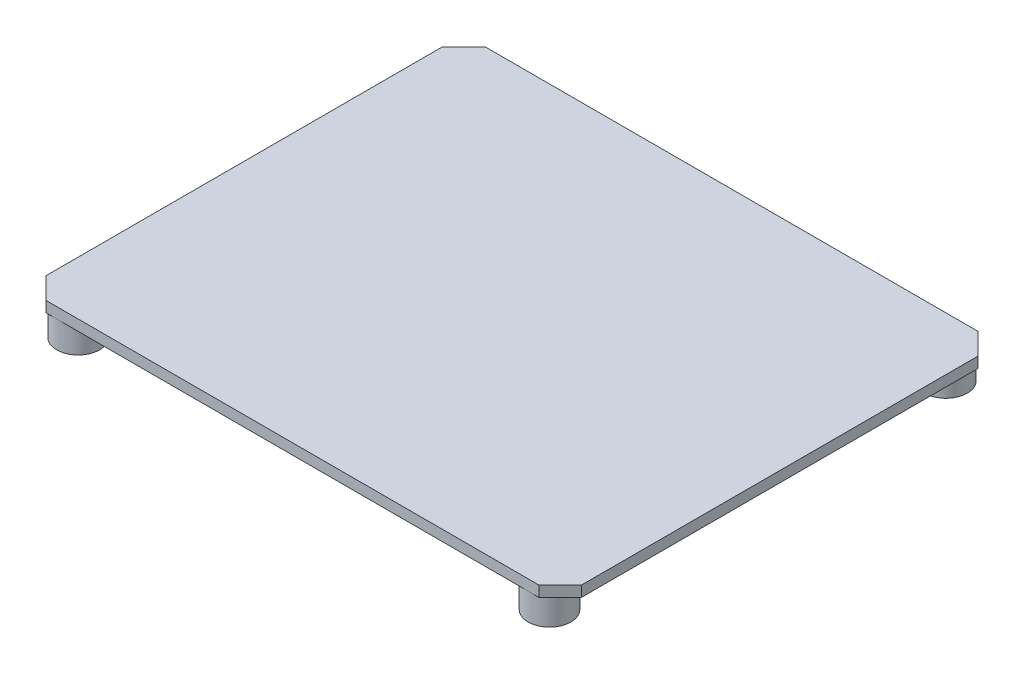
ISO-10303-21;
HEADER;
FILE_DESCRIPTION(('STEP AP214'),'2;1');
FILE_NAME('part.step','',(''),(''),'','','');
FILE_SCHEMA(('AUTOMOTIVE_DESIGN { 1 0 10303 214 1 1 1 1 }'));
ENDSEC;
DATA;
#1=APPLICATION_CONTEXT('core data for automotive mechanical design processes');
#2=APPLICATION_PROTOCOL_DEFINITION('international standard','automotive_design',2000,#1);
#3=PRODUCT_CONTEXT('',#1,'mechanical');
#4=PRODUCT('Part','Part','',(#3));
#5=PRODUCT_RELATED_PRODUCT_CATEGORY('part','',(#4));
#6=PRODUCT_DEFINITION_FORMATION('','',#4);
#7=PRODUCT_DEFINITION_CONTEXT('part definition',#1,'design');
#8=PRODUCT_DEFINITION('design','',#6,#7);
#9=PRODUCT_DEFINITION_SHAPE('','',#8);
#10=(LENGTH_UNIT() NAMED_UNIT(*) SI_UNIT(.MILLI.,.METRE.));
#11=(NAMED_UNIT(*) PLANE_ANGLE_UNIT() SI_UNIT($,.RADIAN.));
#12=(NAMED_UNIT(*) SI_UNIT($,.STERADIAN.) SOLID_ANGLE_UNIT());
#13=UNCERTAINTY_MEASURE_WITH_UNIT(LENGTH_MEASURE(1.E-05),#10,'distance_accuracy_value','');
#14=(GEOMETRIC_REPRESENTATION_CONTEXT(3) GLOBAL_UNCERTAINTY_ASSIGNED_CONTEXT((#13)) GLOBAL_UNIT_ASSIGNED_CONTEXT((#10,
#11,#12)) REPRESENTATION_CONTEXT('',''));
#15=CARTESIAN_POINT('',(0.,0.,0.));
#16=DIRECTION('',(0.,0.,1.));
#17=DIRECTION('',(1.,0.,0.));
#18=AXIS2_PLACEMENT_3D('',#15,#16,#17);
#19=CARTESIAN_POINT('',(-50.,37.4,98.));
#20=DIRECTION('',(0.707106781186547,0.,-0.707106781186547));
#21=DIRECTION('',(-0.707106781186548,0.,-0.707106781186548));
#22=AXIS2_PLACEMENT_3D('',#19,#20,#21);
#23=PLANE('',#22);
#24=DIRECTION('',(0.707106781186547,0.,0.707106781186547));
#25=VECTOR('',#24,1.);
#26=CARTESIAN_POINT('',(-50.,35.4,98.));
#27=LINE('',#26,#25);
#28=CARTESIAN_POINT('',(-50.,35.4,98.));
#29=VERTEX_POINT('',#28);
#30=CARTESIAN_POINT('',(-46.,35.4,102.));
#31=VERTEX_POINT('',#30);
#32=EDGE_CURVE('E143',#29,#31,#27,.T.);
#33=ORIENTED_EDGE('',*,*,#32,.T.);
#34=DIRECTION('',(0.,-1.,0.));
#35=VECTOR('',#34,1.);
#36=CARTESIAN_POINT('',(-46.,37.4,102.));
#37=LINE('',#36,#35);
#38=CARTESIAN_POINT('',(-46.,37.4,102.));
#39=VERTEX_POINT('',#38);
#40=EDGE_CURVE('E176',#39,#31,#37,.T.);
#41=ORIENTED_EDGE('',*,*,#40,.F.);
#42=DIRECTION('',(0.707106781186547,0.,0.707106781186547));
#43=VECTOR('',#42,1.);
#44=CARTESIAN_POINT('',(-50.,37.4,98.));
#45=LINE('',#44,#43);
#46=CARTESIAN_POINT('',(-50.,37.4,98.));
#47=VERTEX_POINT('',#46);
#48=EDGE_CURVE('E163',#47,#39,#45,.T.);
#49=ORIENTED_EDGE('',*,*,#48,.F.);
#50=DIRECTION('',(0.,-1.,0.));
#51=VECTOR('',#50,1.);
#52=CARTESIAN_POINT('',(-50.,37.4,98.));
#53=LINE('',#52,#51);
#54=EDGE_CURVE('E139',#47,#29,#53,.T.);
#55=ORIENTED_EDGE('',*,*,#54,.T.);
#56=EDGE_LOOP('',(#33,#41,#49,#55));
#57=FACE_BOUND('',#56,.T.);
#58=ADVANCED_FACE('F39',(#57),#23,.F.);
#59=CARTESIAN_POINT('',(-46.,37.4,102.));
#60=DIRECTION('',(0.,0.,-1.));
#61=DIRECTION('',(-1.,0.,0.));
#62=AXIS2_PLACEMENT_3D('',#59,#60,#61);
#63=PLANE('',#62);
#64=DIRECTION('',(1.,0.,0.));
#65=VECTOR('',#64,1.);
#66=CARTESIAN_POINT('',(-46.,35.4,102.));
#67=LINE('',#66,#65);
#68=CARTESIAN_POINT('',(-44.,35.4,102.));
#69=VERTEX_POINT('',#68);
#70=EDGE_CURVE('E148',#31,#69,#67,.T.);
#71=ORIENTED_EDGE('',*,*,#70,.T.);
#72=CARTESIAN_POINT('',(44.,35.4,102.));
#73=VERTEX_POINT('',#72);
#74=EDGE_CURVE('E152',#69,#73,#67,.T.);
#75=ORIENTED_EDGE('',*,*,#74,.T.);
#76=CARTESIAN_POINT('',(46.,35.4,102.));
#77=VERTEX_POINT('',#76);
#78=EDGE_CURVE('E146',#73,#77,#67,.T.);
#79=ORIENTED_EDGE('',*,*,#78,.T.);
#80=DIRECTION('',(0.,-1.,0.));
#81=VECTOR('',#80,1.);
#82=CARTESIAN_POINT('',(46.,37.4,102.));
#83=LINE('',#82,#81);
#84=CARTESIAN_POINT('',(46.,37.4,102.));
#85=VERTEX_POINT('',#84);
#86=EDGE_CURVE('E173',#85,#77,#83,.T.);
#87=ORIENTED_EDGE('',*,*,#86,.F.);
#88=DIRECTION('',(1.,0.,0.));
#89=VECTOR('',#88,1.);
#90=CARTESIAN_POINT('',(-46.,37.4,102.));
#91=LINE('',#90,#89);
#92=EDGE_CURVE('E102',#39,#85,#91,.T.);
#93=ORIENTED_EDGE('',*,*,#92,.F.);
#94=ORIENTED_EDGE('',*,*,#40,.T.);
#95=EDGE_LOOP('',(#71,#75,#79,#87,#93,#94));
#96=FACE_BOUND('',#95,.T.);
#97=ADVANCED_FACE('F260',(#96),#63,.F.);
#98=CARTESIAN_POINT('',(46.,37.4,102.));
#99=DIRECTION('',(-0.707106781186547,0.,-0.707106781186547));
#100=DIRECTION('',(-0.707106781186548,0.,0.707106781186548));
#101=AXIS2_PLACEMENT_3D('',#98,#99,#100);
#102=PLANE('',#101);
#103=DIRECTION('',(0.707106781186547,0.,-0.707106781186547));
#104=VECTOR('',#103,1.);
#105=CARTESIAN_POINT('',(46.,35.4,102.));
#106=LINE('',#105,#104);
#107=CARTESIAN_POINT('',(50.,35.4,98.));
#108=VERTEX_POINT('',#107);
#109=EDGE_CURVE('E151',#77,#108,#106,.T.);
#110=ORIENTED_EDGE('',*,*,#109,.T.);
#111=DIRECTION('',(0.,-1.,0.));
#112=VECTOR('',#111,1.);
#113=CARTESIAN_POINT('',(50.,37.4,98.));
#114=LINE('',#113,#112);
#115=CARTESIAN_POINT('',(50.,37.4,98.));
#116=VERTEX_POINT('',#115);
#117=EDGE_CURVE('E170',#116,#108,#114,.T.);
#118=ORIENTED_EDGE('',*,*,#117,.F.);
#119=DIRECTION('',(0.707106781186547,0.,-0.707106781186547));
#120=VECTOR('',#119,1.);
#121=CARTESIAN_POINT('',(46.,37.4,102.));
#122=LINE('',#121,#120);
#123=EDGE_CURVE('E217',#85,#116,#122,.T.);
#124=ORIENTED_EDGE('',*,*,#123,.F.);
#125=ORIENTED_EDGE('',*,*,#86,.T.);
#126=EDGE_LOOP('',(#110,#118,#124,#125));
#127=FACE_BOUND('',#126,.T.);
#128=ADVANCED_FACE('F266',(#127),#102,.F.);
#129=CARTESIAN_POINT('',(50.,37.4,98.));
#130=DIRECTION('',(-1.,0.,0.));
#131=DIRECTION('',(0.,0.,1.));
#132=AXIS2_PLACEMENT_3D('',#129,#130,#131);
#133=PLANE('',#132);
#134=DIRECTION('',(0.,0.,-1.));
#135=VECTOR('',#134,1.);
#136=CARTESIAN_POINT('',(50.,35.4,98.));
#137=LINE('',#136,#135);
#138=CARTESIAN_POINT('',(50.,35.4,24.));
#139=VERTEX_POINT('',#138);
#140=EDGE_CURVE('E154',#108,#139,#137,.T.);
#141=ORIENTED_EDGE('',*,*,#140,.T.);
#142=DIRECTION('',(0.,-1.,0.));
#143=VECTOR('',#142,1.);
#144=CARTESIAN_POINT('',(50.,37.4,24.));
#145=LINE('',#144,#143);
#146=CARTESIAN_POINT('',(50.,37.4,24.));
#147=VERTEX_POINT('',#146);
#148=EDGE_CURVE('E167',#147,#139,#145,.T.);
#149=ORIENTED_EDGE('',*,*,#148,.F.);
#150=DIRECTION('',(0.,0.,-1.));
#151=VECTOR('',#150,1.);
#152=CARTESIAN_POINT('',(50.,37.4,98.));
#153=LINE('',#152,#151);
#154=EDGE_CURVE('E219',#116,#147,#153,.T.);
#155=ORIENTED_EDGE('',*,*,#154,.F.);
#156=ORIENTED_EDGE('',*,*,#117,.T.);
#157=EDGE_LOOP('',(#141,#149,#155,#156));
#158=FACE_BOUND('',#157,.T.);
#159=ADVANCED_FACE('F225',(#158),#133,.F.);
#160=CARTESIAN_POINT('',(50.,37.4,24.));
#161=DIRECTION('',(-0.707106781186547,0.,0.707106781186548));
#162=DIRECTION('',(0.707106781186548,0.,0.707106781186547));
#163=AXIS2_PLACEMENT_3D('',#160,#161,#162);
#164=PLANE('',#163);
#165=DIRECTION('',(-0.707106781186548,0.,-0.707106781186547));
#166=VECTOR('',#165,1.);
#167=CARTESIAN_POINT('',(50.,35.4,24.));
#168=LINE('',#167,#166);
#169=CARTESIAN_POINT('',(46.,35.4,20.));
#170=VERTEX_POINT('',#169);
#171=EDGE_CURVE('E156',#139,#170,#168,.T.);
#172=ORIENTED_EDGE('',*,*,#171,.T.);
#173=DIRECTION('',(0.,-1.,0.));
#174=VECTOR('',#173,1.);
#175=CARTESIAN_POINT('',(46.,37.4,20.));
#176=LINE('',#175,#174);
#177=CARTESIAN_POINT('',(46.,37.4,20.));
#178=VERTEX_POINT('',#177);
#179=EDGE_CURVE('E134',#178,#170,#176,.T.);
#180=ORIENTED_EDGE('',*,*,#179,.F.);
#181=DIRECTION('',(-0.707106781186548,0.,-0.707106781186547));
#182=VECTOR('',#181,1.);
#183=CARTESIAN_POINT('',(50.,37.4,24.));
#184=LINE('',#183,#182);
#185=EDGE_CURVE('E123',#147,#178,#184,.T.);
#186=ORIENTED_EDGE('',*,*,#185,.F.);
#187=ORIENTED_EDGE('',*,*,#148,.T.);
#188=EDGE_LOOP('',(#172,#180,#186,#187));
#189=FACE_BOUND('',#188,.T.);
#190=ADVANCED_FACE('F229',(#189),#164,.F.);
#191=CARTESIAN_POINT('',(46.,37.4,20.));
#192=DIRECTION('',(0.,0.,1.));
#193=DIRECTION('',(1.,0.,0.));
#194=AXIS2_PLACEMENT_3D('',#191,#192,#193);
#195=PLANE('',#194);
#196=DIRECTION('',(-1.,0.,0.));
#197=VECTOR('',#196,1.);
#198=CARTESIAN_POINT('',(46.,35.4,20.));
#199=LINE('',#198,#197);
#200=CARTESIAN_POINT('',(44.,35.4,20.));
#201=VERTEX_POINT('',#200);
#202=EDGE_CURVE('E158',#170,#201,#199,.T.);
#203=ORIENTED_EDGE('',*,*,#202,.T.);
#204=CARTESIAN_POINT('',(-44.,35.4,20.));
#205=VERTEX_POINT('',#204);
#206=EDGE_CURVE('E160',#201,#205,#199,.T.);
#207=ORIENTED_EDGE('',*,*,#206,.T.);
#208=CARTESIAN_POINT('',(-46.,35.4,20.));
#209=VERTEX_POINT('',#208);
#210=EDGE_CURVE('E133',#205,#209,#199,.T.);
#211=ORIENTED_EDGE('',*,*,#210,.T.);
#212=DIRECTION('',(0.,-1.,0.));
#213=VECTOR('',#212,1.);
#214=CARTESIAN_POINT('',(-46.,37.4,20.));
#215=LINE('',#214,#213);
#216=CARTESIAN_POINT('',(-46.,37.4,20.));
#217=VERTEX_POINT('',#216);
#218=EDGE_CURVE('E128',#217,#209,#215,.T.);
#219=ORIENTED_EDGE('',*,*,#218,.F.);
#220=DIRECTION('',(-1.,0.,0.));
#221=VECTOR('',#220,1.);
#222=CARTESIAN_POINT('',(46.,37.4,20.));
#223=LINE('',#222,#221);
#224=EDGE_CURVE('E117',#178,#217,#223,.T.);
#225=ORIENTED_EDGE('',*,*,#224,.F.);
#226=ORIENTED_EDGE('',*,*,#179,.T.);
#227=EDGE_LOOP('',(#203,#207,#211,#219,#225,#226));
#228=FACE_BOUND('',#227,.T.);
#229=ADVANCED_FACE('F130',(#228),#195,.F.);
#230=CARTESIAN_POINT('',(-46.,37.4,20.));
#231=DIRECTION('',(0.707106781186547,0.,0.707106781186548));
#232=DIRECTION('',(0.707106781186548,0.,-0.707106781186547));
#233=AXIS2_PLACEMENT_3D('',#230,#231,#232);
#234=PLANE('',#233);
#235=DIRECTION('',(-0.707106781186548,0.,0.707106781186547));
#236=VECTOR('',#235,1.);
#237=CARTESIAN_POINT('',(-46.,35.4,20.));
#238=LINE('',#237,#236);
#239=CARTESIAN_POINT('',(-50.,35.4,24.));
#240=VERTEX_POINT('',#239);
#241=EDGE_CURVE('E87',#209,#240,#238,.T.);
#242=ORIENTED_EDGE('',*,*,#241,.T.);
#243=DIRECTION('',(0.,-1.,0.));
#244=VECTOR('',#243,1.);
#245=CARTESIAN_POINT('',(-50.,37.4,24.));
#246=LINE('',#245,#244);
#247=CARTESIAN_POINT('',(-50.,37.4,24.));
#248=VERTEX_POINT('',#247);
#249=EDGE_CURVE('E135',#248,#240,#246,.T.);
#250=ORIENTED_EDGE('',*,*,#249,.F.);
#251=DIRECTION('',(-0.707106781186548,0.,0.707106781186547));
#252=VECTOR('',#251,1.);
#253=CARTESIAN_POINT('',(-46.,37.4,20.));
#254=LINE('',#253,#252);
#255=EDGE_CURVE('E121',#217,#248,#254,.T.);
#256=ORIENTED_EDGE('',*,*,#255,.F.);
#257=ORIENTED_EDGE('',*,*,#218,.T.);
#258=EDGE_LOOP('',(#242,#250,#256,#257));
#259=FACE_BOUND('',#258,.T.);
#260=ADVANCED_FACE('F137',(#259),#234,.F.);
#261=CARTESIAN_POINT('',(-50.,37.4,24.));
#262=DIRECTION('',(1.,0.,0.));
#263=DIRECTION('',(0.,0.,-1.));
#264=AXIS2_PLACEMENT_3D('',#261,#262,#263);
#265=PLANE('',#264);
#266=DIRECTION('',(0.,0.,1.));
#267=VECTOR('',#266,1.);
#268=CARTESIAN_POINT('',(-50.,35.4,24.));
#269=LINE('',#268,#267);
#270=EDGE_CURVE('E93',#240,#29,#269,.T.);
#271=ORIENTED_EDGE('',*,*,#270,.T.);
#272=ORIENTED_EDGE('',*,*,#54,.F.);
#273=DIRECTION('',(0.,0.,1.));
#274=VECTOR('',#273,1.);
#275=CARTESIAN_POINT('',(-50.,37.4,24.));
#276=LINE('',#275,#274);
#277=EDGE_CURVE('E57',#248,#47,#276,.T.);
#278=ORIENTED_EDGE('',*,*,#277,.F.);
#279=ORIENTED_EDGE('',*,*,#249,.T.);
#280=EDGE_LOOP('',(#271,#272,#278,#279));
#281=FACE_BOUND('',#280,.T.);
#282=ADVANCED_FACE('F288',(#281),#265,.F.);
#283=CARTESIAN_POINT('',(0.,37.4,0.));
#284=DIRECTION('',(0.,1.,0.));
#285=DIRECTION('',(0.,0.,1.));
#286=AXIS2_PLACEMENT_3D('',#283,#284,#285);
#287=PLANE('',#286);
#288=ORIENTED_EDGE('',*,*,#48,.T.);
#289=ORIENTED_EDGE('',*,*,#92,.T.);
#290=ORIENTED_EDGE('',*,*,#123,.T.);
#291=ORIENTED_EDGE('',*,*,#154,.T.);
#292=ORIENTED_EDGE('',*,*,#185,.T.);
#293=ORIENTED_EDGE('',*,*,#224,.T.);
#294=ORIENTED_EDGE('',*,*,#255,.T.);
#295=ORIENTED_EDGE('',*,*,#277,.T.);
#296=EDGE_LOOP('',(#288,#289,#290,#291,#292,#293,#294,#295));
#297=FACE_BOUND('',#296,.T.);
#298=ADVANCED_FACE('F119',(#297),#287,.T.);
#299=CARTESIAN_POINT('',(0.,35.4,0.));
#300=DIRECTION('',(0.,1.,0.));
#301=DIRECTION('',(0.,0.,1.));
#302=AXIS2_PLACEMENT_3D('',#299,#300,#301);
#303=PLANE('',#302);
#304=ORIENTED_EDGE('',*,*,#74,.F.);
#305=CARTESIAN_POINT('',(-44.,35.4,98.));
#306=DIRECTION('',(0.,1.,0.));
#307=DIRECTION('',(0.,0.,1.));
#308=AXIS2_PLACEMENT_3D('',#305,#306,#307);
#309=CIRCLE('',#308,4.);
#310=EDGE_CURVE('E11',#69,#69,#309,.F.);
#311=ORIENTED_EDGE('',*,*,#310,.F.);
#312=ORIENTED_EDGE('',*,*,#70,.F.);
#313=ORIENTED_EDGE('',*,*,#32,.F.);
#314=ORIENTED_EDGE('',*,*,#270,.F.);
#315=ORIENTED_EDGE('',*,*,#241,.F.);
#316=ORIENTED_EDGE('',*,*,#210,.F.);
#317=CARTESIAN_POINT('',(-44.,35.4,24.));
#318=DIRECTION('',(0.,1.,0.));
#319=DIRECTION('',(0.,0.,1.));
#320=AXIS2_PLACEMENT_3D('',#317,#318,#319);
#321=CIRCLE('',#320,4.);
#322=EDGE_CURVE('E178',#205,#205,#321,.F.);
#323=ORIENTED_EDGE('',*,*,#322,.F.);
#324=ORIENTED_EDGE('',*,*,#206,.F.);
#325=CARTESIAN_POINT('',(44.,35.4,24.));
#326=DIRECTION('',(0.,1.,0.));
#327=DIRECTION('',(0.,0.,1.));
#328=AXIS2_PLACEMENT_3D('',#325,#326,#327);
#329=CIRCLE('',#328,4.);
#330=EDGE_CURVE('E48',#201,#201,#329,.F.);
#331=ORIENTED_EDGE('',*,*,#330,.F.);
#332=ORIENTED_EDGE('',*,*,#202,.F.);
#333=ORIENTED_EDGE('',*,*,#171,.F.);
#334=ORIENTED_EDGE('',*,*,#140,.F.);
#335=ORIENTED_EDGE('',*,*,#109,.F.);
#336=ORIENTED_EDGE('',*,*,#78,.F.);
#337=CARTESIAN_POINT('',(44.,35.4,98.));
#338=DIRECTION('',(0.,1.,0.));
#339=DIRECTION('',(0.,0.,1.));
#340=AXIS2_PLACEMENT_3D('',#337,#338,#339);
#341=CIRCLE('',#340,4.);
#342=EDGE_CURVE('E181',#73,#73,#341,.F.);
#343=ORIENTED_EDGE('',*,*,#342,.F.);
#344=EDGE_LOOP('',(#304,#311,#312,#313,#314,#315,#316,#323,#324,#331,#332,#333,#334,#335,#336,#343));
#345=FACE_BOUND('',#344,.T.);
#346=ADVANCED_FACE('F236',(#345),#303,.F.);
#347=CARTESIAN_POINT('',(-44.,35.5,24.));
#348=DIRECTION('',(0.,-1.,0.));
#349=DIRECTION('',(0.,0.,-1.));
#350=AXIS2_PLACEMENT_3D('',#347,#348,#349);
#351=CYLINDRICAL_SURFACE('',#350,4.);
#352=CARTESIAN_POINT('',(-44.,30.4,24.));
#353=DIRECTION('',(0.,1.,0.));
#354=DIRECTION('',(0.,0.,1.));
#355=AXIS2_PLACEMENT_3D('',#352,#353,#354);
#356=CIRCLE('',#355,4.);
#357=CARTESIAN_POINT('',(-44.,30.4,28.));
#358=VERTEX_POINT('',#357);
#359=EDGE_CURVE('E147',#358,#358,#356,.T.);
#360=ORIENTED_EDGE('',*,*,#359,.T.);
#361=EDGE_LOOP('',(#360));
#362=FACE_BOUND('',#361,.T.);
#363=ORIENTED_EDGE('',*,*,#322,.T.);
#364=EDGE_LOOP('',(#363));
#365=FACE_BOUND('',#364,.T.);
#366=ADVANCED_FACE('F293',(#362,#365),#351,.T.);
#367=CARTESIAN_POINT('',(-44.,30.4,24.));
#368=DIRECTION('',(0.,1.,0.));
#369=DIRECTION('',(0.,0.,1.));
#370=AXIS2_PLACEMENT_3D('',#367,#368,#369);
#371=PLANE('',#370);
#372=CARTESIAN_POINT('',(-44.,30.4,24.));
#373=DIRECTION('',(0.,1.,0.));
#374=DIRECTION('',(0.,0.,1.));
#375=AXIS2_PLACEMENT_3D('',#372,#373,#374);
#376=CIRCLE('',#375,1.25);
#377=CARTESIAN_POINT('',(-44.,30.4,25.25));
#378=VERTEX_POINT('',#377);
#379=EDGE_CURVE('E42',#378,#378,#376,.F.);
#380=ORIENTED_EDGE('',*,*,#379,.F.);
#381=EDGE_LOOP('',(#380));
#382=FACE_BOUND('',#381,.T.);
#383=ORIENTED_EDGE('',*,*,#359,.F.);
#384=EDGE_LOOP('',(#383));
#385=FACE_BOUND('',#384,.T.);
#386=ADVANCED_FACE('F298',(#382,#385),#371,.F.);
#387=CARTESIAN_POINT('',(44.,35.5,98.));
#388=DIRECTION('',(0.,-1.,0.));
#389=DIRECTION('',(0.,0.,-1.));
#390=AXIS2_PLACEMENT_3D('',#387,#388,#389);
#391=CYLINDRICAL_SURFACE('',#390,4.);
#392=CARTESIAN_POINT('',(44.,30.4,98.));
#393=DIRECTION('',(0.,1.,0.));
#394=DIRECTION('',(0.,0.,1.));
#395=AXIS2_PLACEMENT_3D('',#392,#393,#394);
#396=CIRCLE('',#395,4.);
#397=CARTESIAN_POINT('',(44.,30.4,102.));
#398=VERTEX_POINT('',#397);
#399=EDGE_CURVE('E197',#398,#398,#396,.T.);
#400=ORIENTED_EDGE('',*,*,#399,.T.);
#401=EDGE_LOOP('',(#400));
#402=FACE_BOUND('',#401,.T.);
#403=ORIENTED_EDGE('',*,*,#342,.T.);
#404=EDGE_LOOP('',(#403));
#405=FACE_BOUND('',#404,.T.);
#406=ADVANCED_FACE('F255',(#402,#405),#391,.T.);
#407=CARTESIAN_POINT('',(44.,30.4,98.));
#408=DIRECTION('',(0.,1.,0.));
#409=DIRECTION('',(0.,0.,1.));
#410=AXIS2_PLACEMENT_3D('',#407,#408,#409);
#411=PLANE('',#410);
#412=CARTESIAN_POINT('',(44.,30.4,98.));
#413=DIRECTION('',(0.,1.,0.));
#414=DIRECTION('',(0.,0.,1.));
#415=AXIS2_PLACEMENT_3D('',#412,#413,#414);
#416=CIRCLE('',#415,1.25);
#417=CARTESIAN_POINT('',(44.,30.4,99.25));
#418=VERTEX_POINT('',#417);
#419=EDGE_CURVE('E192',#418,#418,#416,.F.);
#420=ORIENTED_EDGE('',*,*,#419,.F.);
#421=EDGE_LOOP('',(#420));
#422=FACE_BOUND('',#421,.T.);
#423=ORIENTED_EDGE('',*,*,#399,.F.);
#424=EDGE_LOOP('',(#423));
#425=FACE_BOUND('',#424,.T.);
#426=ADVANCED_FACE('F243',(#422,#425),#411,.F.);
#427=CARTESIAN_POINT('',(44.,35.5,24.));
#428=DIRECTION('',(0.,-1.,0.));
#429=DIRECTION('',(0.,0.,-1.));
#430=AXIS2_PLACEMENT_3D('',#427,#428,#429);
#431=CYLINDRICAL_SURFACE('',#430,4.);
#432=CARTESIAN_POINT('',(44.,30.4,24.));
#433=DIRECTION('',(0.,1.,0.));
#434=DIRECTION('',(0.,0.,1.));
#435=AXIS2_PLACEMENT_3D('',#432,#433,#434);
#436=CIRCLE('',#435,4.);
#437=CARTESIAN_POINT('',(44.,30.4,28.));
#438=VERTEX_POINT('',#437);
#439=EDGE_CURVE('E201',#438,#438,#436,.T.);
#440=ORIENTED_EDGE('',*,*,#439,.T.);
#441=EDGE_LOOP('',(#440));
#442=FACE_BOUND('',#441,.T.);
#443=ORIENTED_EDGE('',*,*,#330,.T.);
#444=EDGE_LOOP('',(#443));
#445=FACE_BOUND('',#444,.T.);
#446=ADVANCED_FACE('F240',(#442,#445),#431,.T.);
#447=CARTESIAN_POINT('',(44.,30.4,24.));
#448=DIRECTION('',(0.,1.,0.));
#449=DIRECTION('',(0.,0.,1.));
#450=AXIS2_PLACEMENT_3D('',#447,#448,#449);
#451=PLANE('',#450);
#452=CARTESIAN_POINT('',(44.,30.4,24.));
#453=DIRECTION('',(0.,1.,0.));
#454=DIRECTION('',(0.,0.,1.));
#455=AXIS2_PLACEMENT_3D('',#452,#453,#454);
#456=CIRCLE('',#455,1.25);
#457=CARTESIAN_POINT('',(44.,30.4,25.25));
#458=VERTEX_POINT('',#457);
#459=EDGE_CURVE('E189',#458,#458,#456,.F.);
#460=ORIENTED_EDGE('',*,*,#459,.F.);
#461=EDGE_LOOP('',(#460));
#462=FACE_BOUND('',#461,.T.);
#463=ORIENTED_EDGE('',*,*,#439,.F.);
#464=EDGE_LOOP('',(#463));
#465=FACE_BOUND('',#464,.T.);
#466=ADVANCED_FACE('F242',(#462,#465),#451,.F.);
#467=CARTESIAN_POINT('',(-44.,35.5,98.));
#468=DIRECTION('',(0.,-1.,0.));
#469=DIRECTION('',(0.,0.,-1.));
#470=AXIS2_PLACEMENT_3D('',#467,#468,#469);
#471=CYLINDRICAL_SURFACE('',#470,4.);
#472=CARTESIAN_POINT('',(-44.,30.4,98.));
#473=DIRECTION('',(0.,1.,0.));
#474=DIRECTION('',(0.,0.,1.));
#475=AXIS2_PLACEMENT_3D('',#472,#473,#474);
#476=CIRCLE('',#475,4.);
#477=CARTESIAN_POINT('',(-44.,30.4,102.));
#478=VERTEX_POINT('',#477);
#479=EDGE_CURVE('E206',#478,#478,#476,.T.);
#480=ORIENTED_EDGE('',*,*,#479,.T.);
#481=EDGE_LOOP('',(#480));
#482=FACE_BOUND('',#481,.T.);
#483=ORIENTED_EDGE('',*,*,#310,.T.);
#484=EDGE_LOOP('',(#483));
#485=FACE_BOUND('',#484,.T.);
#486=ADVANCED_FACE('F251',(#482,#485),#471,.T.);
#487=CARTESIAN_POINT('',(-44.,30.4,98.));
#488=DIRECTION('',(0.,1.,0.));
#489=DIRECTION('',(0.,0.,1.));
#490=AXIS2_PLACEMENT_3D('',#487,#488,#489);
#491=PLANE('',#490);
#492=CARTESIAN_POINT('',(-44.,30.4,98.));
#493=DIRECTION('',(0.,1.,0.));
#494=DIRECTION('',(0.,0.,1.));
#495=AXIS2_PLACEMENT_3D('',#492,#493,#494);
#496=CIRCLE('',#495,1.25);
#497=CARTESIAN_POINT('',(-44.,30.4,99.25));
#498=VERTEX_POINT('',#497);
#499=EDGE_CURVE('E186',#498,#498,#496,.F.);
#500=ORIENTED_EDGE('',*,*,#499,.F.);
#501=EDGE_LOOP('',(#500));
#502=FACE_BOUND('',#501,.T.);
#503=ORIENTED_EDGE('',*,*,#479,.F.);
#504=EDGE_LOOP('',(#503));
#505=FACE_BOUND('',#504,.T.);
#506=ADVANCED_FACE('F318',(#502,#505),#491,.F.);
#507=CARTESIAN_POINT('',(-44.,36.4,98.));
#508=DIRECTION('',(0.,-1.,0.));
#509=DIRECTION('',(0.,0.,-1.));
#510=AXIS2_PLACEMENT_3D('',#507,#508,#509);
#511=CYLINDRICAL_SURFACE('',#510,1.25);
#512=CARTESIAN_POINT('',(-44.,36.4,98.));
#513=DIRECTION('',(0.,1.,0.));
#514=DIRECTION('',(0.,0.,1.));
#515=AXIS2_PLACEMENT_3D('',#512,#513,#514);
#516=CIRCLE('',#515,1.25);
#517=CARTESIAN_POINT('',(-44.,36.4,99.25));
#518=VERTEX_POINT('',#517);
#519=EDGE_CURVE('E361',#518,#518,#516,.T.);
#520=ORIENTED_EDGE('',*,*,#519,.T.);
#521=EDGE_LOOP('',(#520));
#522=FACE_BOUND('',#521,.T.);
#523=ORIENTED_EDGE('',*,*,#499,.T.);
#524=EDGE_LOOP('',(#523));
#525=FACE_BOUND('',#524,.T.);
#526=ADVANCED_FACE('F321',(#522,#525),#511,.F.);
#527=CARTESIAN_POINT('',(-44.,36.4,98.));
#528=DIRECTION('',(0.,1.,0.));
#529=DIRECTION('',(0.,0.,1.));
#530=AXIS2_PLACEMENT_3D('',#527,#528,#529);
#531=PLANE('',#530);
#532=ORIENTED_EDGE('',*,*,#519,.F.);
#533=EDGE_LOOP('',(#532));
#534=FACE_BOUND('',#533,.T.);
#535=ADVANCED_FACE('F326',(#534),#531,.F.);
#536=CARTESIAN_POINT('',(44.,36.4,24.));
#537=DIRECTION('',(0.,-1.,0.));
#538=DIRECTION('',(0.,0.,-1.));
#539=AXIS2_PLACEMENT_3D('',#536,#537,#538);
#540=CYLINDRICAL_SURFACE('',#539,1.25);
#541=CARTESIAN_POINT('',(44.,36.4,24.));
#542=DIRECTION('',(0.,1.,0.));
#543=DIRECTION('',(0.,0.,1.));
#544=AXIS2_PLACEMENT_3D('',#541,#542,#543);
#545=CIRCLE('',#544,1.25);
#546=CARTESIAN_POINT('',(44.,36.4,25.25));
#547=VERTEX_POINT('',#546);
#548=EDGE_CURVE('E362',#547,#547,#545,.T.);
#549=ORIENTED_EDGE('',*,*,#548,.T.);
#550=EDGE_LOOP('',(#549));
#551=FACE_BOUND('',#550,.T.);
#552=ORIENTED_EDGE('',*,*,#459,.T.);
#553=EDGE_LOOP('',(#552));
#554=FACE_BOUND('',#553,.T.);
#555=ADVANCED_FACE('F337',(#551,#554),#540,.F.);
#556=CARTESIAN_POINT('',(44.,36.4,24.));
#557=DIRECTION('',(0.,1.,0.));
#558=DIRECTION('',(0.,0.,1.));
#559=AXIS2_PLACEMENT_3D('',#556,#557,#558);
#560=PLANE('',#559);
#561=ORIENTED_EDGE('',*,*,#548,.F.);
#562=EDGE_LOOP('',(#561));
#563=FACE_BOUND('',#562,.T.);
#564=ADVANCED_FACE('F347',(#563),#560,.F.);
#565=CARTESIAN_POINT('',(44.,36.4,98.));
#566=DIRECTION('',(0.,-1.,0.));
#567=DIRECTION('',(0.,0.,-1.));
#568=AXIS2_PLACEMENT_3D('',#565,#566,#567);
#569=CYLINDRICAL_SURFACE('',#568,1.25);
#570=CARTESIAN_POINT('',(44.,36.4,98.));
#571=DIRECTION('',(0.,1.,0.));
#572=DIRECTION('',(0.,0.,1.));
#573=AXIS2_PLACEMENT_3D('',#570,#571,#572);
#574=CIRCLE('',#573,1.25);
#575=CARTESIAN_POINT('',(44.,36.4,99.25));
#576=VERTEX_POINT('',#575);
#577=EDGE_CURVE('E366',#576,#576,#574,.T.);
#578=ORIENTED_EDGE('',*,*,#577,.T.);
#579=EDGE_LOOP('',(#578));
#580=FACE_BOUND('',#579,.T.);
#581=ORIENTED_EDGE('',*,*,#419,.T.);
#582=EDGE_LOOP('',(#581));
#583=FACE_BOUND('',#582,.T.);
#584=ADVANCED_FACE('F350',(#580,#583),#569,.F.);
#585=CARTESIAN_POINT('',(44.,36.4,98.));
#586=DIRECTION('',(0.,1.,0.));
#587=DIRECTION('',(0.,0.,1.));
#588=AXIS2_PLACEMENT_3D('',#585,#586,#587);
#589=PLANE('',#588);
#590=ORIENTED_EDGE('',*,*,#577,.F.);
#591=EDGE_LOOP('',(#590));
#592=FACE_BOUND('',#591,.T.);
#593=ADVANCED_FACE('F342',(#592),#589,.F.);
#594=CARTESIAN_POINT('',(-44.,36.4,24.));
#595=DIRECTION('',(0.,-1.,0.));
#596=DIRECTION('',(0.,0.,-1.));
#597=AXIS2_PLACEMENT_3D('',#594,#595,#596);
#598=CYLINDRICAL_SURFACE('',#597,1.25);
#599=CARTESIAN_POINT('',(-44.,36.4,24.));
#600=DIRECTION('',(0.,1.,0.));
#601=DIRECTION('',(0.,0.,1.));
#602=AXIS2_PLACEMENT_3D('',#599,#600,#601);
#603=CIRCLE('',#602,1.25);
#604=CARTESIAN_POINT('',(-44.,36.4,25.25));
#605=VERTEX_POINT('',#604);
#606=EDGE_CURVE('E190',#605,#605,#603,.T.);
#607=ORIENTED_EDGE('',*,*,#606,.T.);
#608=EDGE_LOOP('',(#607));
#609=FACE_BOUND('',#608,.T.);
#610=ORIENTED_EDGE('',*,*,#379,.T.);
#611=EDGE_LOOP('',(#610));
#612=FACE_BOUND('',#611,.T.);
#613=ADVANCED_FACE('F315',(#609,#612),#598,.F.);
#614=CARTESIAN_POINT('',(-44.,36.4,24.));
#615=DIRECTION('',(0.,1.,0.));
#616=DIRECTION('',(0.,0.,1.));
#617=AXIS2_PLACEMENT_3D('',#614,#615,#616);
#618=PLANE('',#617);
#619=ORIENTED_EDGE('',*,*,#606,.F.);
#620=EDGE_LOOP('',(#619));
#621=FACE_BOUND('',#620,.T.);
#622=ADVANCED_FACE('F352',(#621),#618,.F.);
#623=CLOSED_SHELL('',(#58,#97,#128,#159,#190,#229,#260,#282,#298,#346,#366,#386,#406,#426,#446,
#466,#486,#506,#526,#535,#555,#564,#584,#593,#613,#622));
#624=MANIFOLD_SOLID_BREP('B2',#623);
#625=ADVANCED_BREP_SHAPE_REPRESENTATION('',(#18,#624),#14);
#626=SHAPE_DEFINITION_REPRESENTATION(#9,#625);
ENDSEC;
END-ISO-10303-21;
